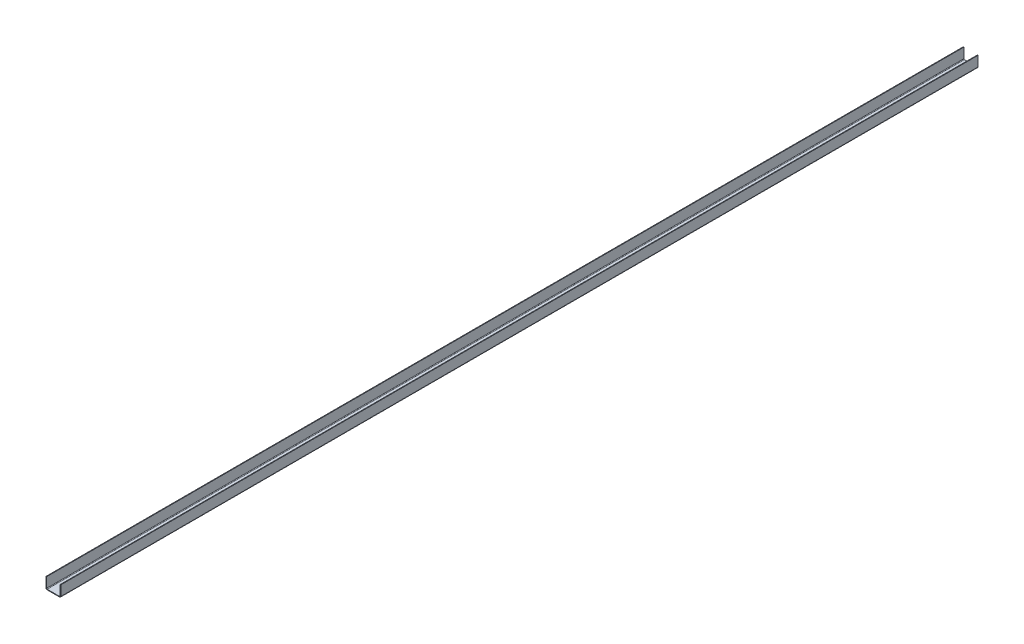
ISO-10303-21;
HEADER;
FILE_DESCRIPTION(('STEP AP214'),'2;1');
FILE_NAME('part.step','',(''),(''),'','','');
FILE_SCHEMA(('AUTOMOTIVE_DESIGN { 1 0 10303 214 1 1 1 1 }'));
ENDSEC;
DATA;
#1=APPLICATION_CONTEXT('core data for automotive mechanical design processes');
#2=APPLICATION_PROTOCOL_DEFINITION('international standard','automotive_design',2000,#1);
#3=PRODUCT_CONTEXT('',#1,'mechanical');
#4=PRODUCT('Part','Part','',(#3));
#5=PRODUCT_RELATED_PRODUCT_CATEGORY('part','',(#4));
#6=PRODUCT_DEFINITION_FORMATION('','',#4);
#7=PRODUCT_DEFINITION_CONTEXT('part definition',#1,'design');
#8=PRODUCT_DEFINITION('design','',#6,#7);
#9=PRODUCT_DEFINITION_SHAPE('','',#8);
#10=(LENGTH_UNIT() NAMED_UNIT(*) SI_UNIT(.MILLI.,.METRE.));
#11=(NAMED_UNIT(*) PLANE_ANGLE_UNIT() SI_UNIT($,.RADIAN.));
#12=(NAMED_UNIT(*) SI_UNIT($,.STERADIAN.) SOLID_ANGLE_UNIT());
#13=UNCERTAINTY_MEASURE_WITH_UNIT(LENGTH_MEASURE(1.E-05),#10,'distance_accuracy_value','');
#14=(GEOMETRIC_REPRESENTATION_CONTEXT(3) GLOBAL_UNCERTAINTY_ASSIGNED_CONTEXT((#13)) GLOBAL_UNIT_ASSIGNED_CONTEXT((#10,
#11,#12)) REPRESENTATION_CONTEXT('',''));
#15=CARTESIAN_POINT('',(0.,0.,0.));
#16=DIRECTION('',(0.,0.,1.));
#17=DIRECTION('',(1.,0.,0.));
#18=AXIS2_PLACEMENT_3D('',#15,#16,#17);
#19=CARTESIAN_POINT('',(0.,-34.5,1915.));
#20=DIRECTION('',(0.,1.,0.));
#21=DIRECTION('',(0.,0.,1.));
#22=AXIS2_PLACEMENT_3D('',#19,#20,#21);
#23=CYLINDRICAL_SURFACE('',#22,3.24999999999999);
#24=CARTESIAN_POINT('',(0.,-26.,1915.));
#25=DIRECTION('',(0.,-1.,0.));
#26=DIRECTION('',(0.,0.,-1.));
#27=AXIS2_PLACEMENT_3D('',#24,#25,#26);
#28=CIRCLE('',#27,3.24999999999999);
#29=CARTESIAN_POINT('',(0.,-26.,1911.75));
#30=VERTEX_POINT('',#29);
#31=EDGE_CURVE('E44',#30,#30,#28,.T.);
#32=ORIENTED_EDGE('',*,*,#31,.T.);
#33=EDGE_LOOP('',(#32));
#34=FACE_BOUND('',#33,.T.);
#35=CARTESIAN_POINT('',(0.,-24.5,1915.));
#36=DIRECTION('',(0.,1.,0.));
#37=DIRECTION('',(0.,0.,1.));
#38=AXIS2_PLACEMENT_3D('',#35,#36,#37);
#39=CIRCLE('',#38,3.24999999999999);
#40=CARTESIAN_POINT('',(0.,-24.5,1918.25));
#41=VERTEX_POINT('',#40);
#42=EDGE_CURVE('E11',#41,#41,#39,.T.);
#43=ORIENTED_EDGE('',*,*,#42,.T.);
#44=EDGE_LOOP('',(#43));
#45=FACE_BOUND('',#44,.T.);
#46=ADVANCED_FACE('F36',(#34,#45),#23,.F.);
#47=CARTESIAN_POINT('',(-18.66,-23.,2300.));
#48=DIRECTION('',(-1.,0.,0.));
#49=DIRECTION('',(0.,0.,1.));
#50=AXIS2_PLACEMENT_3D('',#47,#48,#49);
#51=PLANE('',#50);
#52=DIRECTION('',(0.,1.,0.));
#53=VECTOR('',#52,1.);
#54=CARTESIAN_POINT('',(-18.66,-23.,0.));
#55=LINE('',#54,#53);
#56=CARTESIAN_POINT('',(-18.66,-23.,0.));
#57=VERTEX_POINT('',#56);
#58=CARTESIAN_POINT('',(-18.66,2.,0.));
#59=VERTEX_POINT('',#58);
#60=EDGE_CURVE('E158',#57,#59,#55,.T.);
#61=ORIENTED_EDGE('',*,*,#60,.T.);
#62=DIRECTION('',(0.,0.,-1.));
#63=VECTOR('',#62,1.);
#64=CARTESIAN_POINT('',(-18.66,2.,2300.));
#65=LINE('',#64,#63);
#66=CARTESIAN_POINT('',(-18.66,2.,2300.));
#67=VERTEX_POINT('',#66);
#68=EDGE_CURVE('E205',#67,#59,#65,.T.);
#69=ORIENTED_EDGE('',*,*,#68,.F.);
#70=DIRECTION('',(0.,1.,0.));
#71=VECTOR('',#70,1.);
#72=CARTESIAN_POINT('',(-18.66,-23.,2300.));
#73=LINE('',#72,#71);
#74=CARTESIAN_POINT('',(-18.66,-23.,2300.));
#75=VERTEX_POINT('',#74);
#76=EDGE_CURVE('E105',#75,#67,#73,.T.);
#77=ORIENTED_EDGE('',*,*,#76,.F.);
#78=DIRECTION('',(0.,0.,-1.));
#79=VECTOR('',#78,1.);
#80=CARTESIAN_POINT('',(-18.66,-23.,2300.));
#81=LINE('',#80,#79);
#82=EDGE_CURVE('E154',#75,#57,#81,.T.);
#83=ORIENTED_EDGE('',*,*,#82,.T.);
#84=EDGE_LOOP('',(#61,#69,#77,#83));
#85=FACE_BOUND('',#84,.T.);
#86=ADVANCED_FACE('F230',(#85),#51,.F.);
#87=CARTESIAN_POINT('',(-20.16,2.,2300.));
#88=DIRECTION('',(0.,1.,0.));
#89=DIRECTION('',(-1.,0.,0.));
#90=AXIS2_PLACEMENT_3D('',#87,#88,#89);
#91=PLANE('',#90);
#92=DIRECTION('',(1.,0.,0.));
#93=VECTOR('',#92,1.);
#94=CARTESIAN_POINT('',(-20.16,2.,0.));
#95=LINE('',#94,#93);
#96=CARTESIAN_POINT('',(-20.16,2.,0.));
#97=VERTEX_POINT('',#96);
#98=EDGE_CURVE('E161',#97,#59,#95,.T.);
#99=ORIENTED_EDGE('',*,*,#98,.F.);
#100=DIRECTION('',(0.,0.,-1.));
#101=VECTOR('',#100,1.);
#102=CARTESIAN_POINT('',(-20.16,2.,2300.));
#103=LINE('',#102,#101);
#104=CARTESIAN_POINT('',(-20.16,2.,2300.));
#105=VERTEX_POINT('',#104);
#106=EDGE_CURVE('E203',#105,#97,#103,.T.);
#107=ORIENTED_EDGE('',*,*,#106,.F.);
#108=DIRECTION('',(1.,0.,0.));
#109=VECTOR('',#108,1.);
#110=CARTESIAN_POINT('',(-20.16,2.,2300.));
#111=LINE('',#110,#109);
#112=EDGE_CURVE('E265',#105,#67,#111,.T.);
#113=ORIENTED_EDGE('',*,*,#112,.T.);
#114=ORIENTED_EDGE('',*,*,#68,.T.);
#115=EDGE_LOOP('',(#99,#107,#113,#114));
#116=FACE_BOUND('',#115,.T.);
#117=ADVANCED_FACE('F234',(#116),#91,.T.);
#118=CARTESIAN_POINT('',(-20.16,-23.,2300.));
#119=DIRECTION('',(-1.,0.,0.));
#120=DIRECTION('',(0.,0.,1.));
#121=AXIS2_PLACEMENT_3D('',#118,#119,#120);
#122=PLANE('',#121);
#123=DIRECTION('',(0.,1.,0.));
#124=VECTOR('',#123,1.);
#125=CARTESIAN_POINT('',(-20.16,-23.,0.));
#126=LINE('',#125,#124);
#127=CARTESIAN_POINT('',(-20.16,-23.,0.));
#128=VERTEX_POINT('',#127);
#129=EDGE_CURVE('E165',#128,#97,#126,.T.);
#130=ORIENTED_EDGE('',*,*,#129,.F.);
#131=DIRECTION('',(0.,0.,-1.));
#132=VECTOR('',#131,1.);
#133=CARTESIAN_POINT('',(-20.16,-23.,2300.));
#134=LINE('',#133,#132);
#135=CARTESIAN_POINT('',(-20.16,-23.,2300.));
#136=VERTEX_POINT('',#135);
#137=EDGE_CURVE('E201',#136,#128,#134,.T.);
#138=ORIENTED_EDGE('',*,*,#137,.F.);
#139=DIRECTION('',(0.,1.,0.));
#140=VECTOR('',#139,1.);
#141=CARTESIAN_POINT('',(-20.16,-23.,2300.));
#142=LINE('',#141,#140);
#143=EDGE_CURVE('E261',#136,#105,#142,.T.);
#144=ORIENTED_EDGE('',*,*,#143,.T.);
#145=ORIENTED_EDGE('',*,*,#106,.T.);
#146=EDGE_LOOP('',(#130,#138,#144,#145));
#147=FACE_BOUND('',#146,.T.);
#148=ADVANCED_FACE('F224',(#147),#122,.T.);
#149=CARTESIAN_POINT('',(-17.16,-23.,2300.));
#150=DIRECTION('',(0.,0.,-1.));
#151=DIRECTION('',(-1.,0.,0.));
#152=AXIS2_PLACEMENT_3D('',#149,#150,#151);
#153=CYLINDRICAL_SURFACE('',#152,3.);
#154=CARTESIAN_POINT('',(-17.16,-23.,0.));
#155=DIRECTION('',(0.,0.,-1.));
#156=DIRECTION('',(1.,0.,0.));
#157=AXIS2_PLACEMENT_3D('',#154,#155,#156);
#158=CIRCLE('',#157,3.);
#159=CARTESIAN_POINT('',(-17.16,-26.,0.));
#160=VERTEX_POINT('',#159);
#161=EDGE_CURVE('E168',#160,#128,#158,.T.);
#162=ORIENTED_EDGE('',*,*,#161,.F.);
#163=DIRECTION('',(0.,0.,-1.));
#164=VECTOR('',#163,1.);
#165=CARTESIAN_POINT('',(-17.16,-26.,2300.));
#166=LINE('',#165,#164);
#167=CARTESIAN_POINT('',(-17.16,-26.,2300.));
#168=VERTEX_POINT('',#167);
#169=EDGE_CURVE('E199',#168,#160,#166,.T.);
#170=ORIENTED_EDGE('',*,*,#169,.F.);
#171=CARTESIAN_POINT('',(-17.16,-23.,2300.));
#172=DIRECTION('',(0.,0.,-1.));
#173=DIRECTION('',(1.,0.,0.));
#174=AXIS2_PLACEMENT_3D('',#171,#172,#173);
#175=CIRCLE('',#174,3.);
#176=EDGE_CURVE('E257',#168,#136,#175,.T.);
#177=ORIENTED_EDGE('',*,*,#176,.T.);
#178=ORIENTED_EDGE('',*,*,#137,.T.);
#179=EDGE_LOOP('',(#162,#170,#177,#178));
#180=FACE_BOUND('',#179,.T.);
#181=ADVANCED_FACE('F214',(#180),#153,.T.);
#182=CARTESIAN_POINT('',(13.84,-26.,2300.));
#183=DIRECTION('',(0.,-1.,0.));
#184=DIRECTION('',(0.,0.,-1.));
#185=AXIS2_PLACEMENT_3D('',#182,#183,#184);
#186=PLANE('',#185);
#187=CARTESIAN_POINT('',(0.,-26.,1149.));
#188=DIRECTION('',(0.,-1.,0.));
#189=DIRECTION('',(0.,0.,-1.));
#190=AXIS2_PLACEMENT_3D('',#187,#188,#189);
#191=CIRCLE('',#190,3.24999999999999);
#192=CARTESIAN_POINT('',(0.,-26.,1145.75));
#193=VERTEX_POINT('',#192);
#194=EDGE_CURVE('E385',#193,#193,#191,.T.);
#195=ORIENTED_EDGE('',*,*,#194,.F.);
#196=EDGE_LOOP('',(#195));
#197=FACE_BOUND('',#196,.T.);
#198=CARTESIAN_POINT('',(0.,-26.,383.));
#199=DIRECTION('',(0.,-1.,0.));
#200=DIRECTION('',(0.,0.,-1.));
#201=AXIS2_PLACEMENT_3D('',#198,#199,#200);
#202=CIRCLE('',#201,3.24999999999999);
#203=CARTESIAN_POINT('',(0.,-26.,379.75));
#204=VERTEX_POINT('',#203);
#205=EDGE_CURVE('E162',#204,#204,#202,.T.);
#206=ORIENTED_EDGE('',*,*,#205,.F.);
#207=EDGE_LOOP('',(#206));
#208=FACE_BOUND('',#207,.T.);
#209=DIRECTION('',(-1.,0.,0.));
#210=VECTOR('',#209,1.);
#211=CARTESIAN_POINT('',(13.84,-26.,0.));
#212=LINE('',#211,#210);
#213=CARTESIAN_POINT('',(13.84,-26.,0.));
#214=VERTEX_POINT('',#213);
#215=EDGE_CURVE('E171',#214,#160,#212,.T.);
#216=ORIENTED_EDGE('',*,*,#215,.F.);
#217=DIRECTION('',(0.,0.,-1.));
#218=VECTOR('',#217,1.);
#219=CARTESIAN_POINT('',(13.84,-26.,2300.));
#220=LINE('',#219,#218);
#221=CARTESIAN_POINT('',(13.84,-26.,2300.));
#222=VERTEX_POINT('',#221);
#223=EDGE_CURVE('E197',#222,#214,#220,.T.);
#224=ORIENTED_EDGE('',*,*,#223,.F.);
#225=DIRECTION('',(-1.,0.,0.));
#226=VECTOR('',#225,1.);
#227=CARTESIAN_POINT('',(13.84,-26.,2300.));
#228=LINE('',#227,#226);
#229=EDGE_CURVE('E260',#222,#168,#228,.T.);
#230=ORIENTED_EDGE('',*,*,#229,.T.);
#231=ORIENTED_EDGE('',*,*,#169,.T.);
#232=EDGE_LOOP('',(#216,#224,#230,#231));
#233=FACE_BOUND('',#232,.T.);
#234=ORIENTED_EDGE('',*,*,#31,.F.);
#235=EDGE_LOOP('',(#234));
#236=FACE_BOUND('',#235,.T.);
#237=ADVANCED_FACE('F211',(#197,#208,#233,#236),#186,.T.);
#238=CARTESIAN_POINT('',(13.84,-23.,2300.));
#239=DIRECTION('',(0.,0.,-1.));
#240=DIRECTION('',(-1.,0.,0.));
#241=AXIS2_PLACEMENT_3D('',#238,#239,#240);
#242=CYLINDRICAL_SURFACE('',#241,3.);
#243=CARTESIAN_POINT('',(13.84,-23.,0.));
#244=DIRECTION('',(0.,0.,-1.));
#245=DIRECTION('',(-1.,0.,0.));
#246=AXIS2_PLACEMENT_3D('',#243,#244,#245);
#247=CIRCLE('',#246,3.);
#248=CARTESIAN_POINT('',(16.84,-23.,0.));
#249=VERTEX_POINT('',#248);
#250=EDGE_CURVE('E174',#249,#214,#247,.T.);
#251=ORIENTED_EDGE('',*,*,#250,.F.);
#252=DIRECTION('',(0.,0.,-1.));
#253=VECTOR('',#252,1.);
#254=CARTESIAN_POINT('',(16.84,-23.,2300.));
#255=LINE('',#254,#253);
#256=CARTESIAN_POINT('',(16.84,-23.,2300.));
#257=VERTEX_POINT('',#256);
#258=EDGE_CURVE('E195',#257,#249,#255,.T.);
#259=ORIENTED_EDGE('',*,*,#258,.F.);
#260=CARTESIAN_POINT('',(13.84,-23.,2300.));
#261=DIRECTION('',(0.,0.,-1.));
#262=DIRECTION('',(-1.,0.,0.));
#263=AXIS2_PLACEMENT_3D('',#260,#261,#262);
#264=CIRCLE('',#263,3.);
#265=EDGE_CURVE('E263',#257,#222,#264,.T.);
#266=ORIENTED_EDGE('',*,*,#265,.T.);
#267=ORIENTED_EDGE('',*,*,#223,.T.);
#268=EDGE_LOOP('',(#251,#259,#266,#267));
#269=FACE_BOUND('',#268,.T.);
#270=ADVANCED_FACE('F213',(#269),#242,.T.);
#271=CARTESIAN_POINT('',(16.84,2.,2300.));
#272=DIRECTION('',(1.,0.,0.));
#273=DIRECTION('',(0.,1.,0.));
#274=AXIS2_PLACEMENT_3D('',#271,#272,#273);
#275=PLANE('',#274);
#276=DIRECTION('',(0.,-1.,0.));
#277=VECTOR('',#276,1.);
#278=CARTESIAN_POINT('',(16.84,2.,0.));
#279=LINE('',#278,#277);
#280=CARTESIAN_POINT('',(16.84,2.,0.));
#281=VERTEX_POINT('',#280);
#282=EDGE_CURVE('E177',#281,#249,#279,.T.);
#283=ORIENTED_EDGE('',*,*,#282,.F.);
#284=DIRECTION('',(0.,0.,-1.));
#285=VECTOR('',#284,1.);
#286=CARTESIAN_POINT('',(16.84,2.,2300.));
#287=LINE('',#286,#285);
#288=CARTESIAN_POINT('',(16.84,2.,2300.));
#289=VERTEX_POINT('',#288);
#290=EDGE_CURVE('E193',#289,#281,#287,.T.);
#291=ORIENTED_EDGE('',*,*,#290,.F.);
#292=DIRECTION('',(0.,-1.,0.));
#293=VECTOR('',#292,1.);
#294=CARTESIAN_POINT('',(16.84,2.,2300.));
#295=LINE('',#294,#293);
#296=EDGE_CURVE('E271',#289,#257,#295,.T.);
#297=ORIENTED_EDGE('',*,*,#296,.T.);
#298=ORIENTED_EDGE('',*,*,#258,.T.);
#299=EDGE_LOOP('',(#283,#291,#297,#298));
#300=FACE_BOUND('',#299,.T.);
#301=ADVANCED_FACE('F221',(#300),#275,.T.);
#302=CARTESIAN_POINT('',(15.34,2.,2300.));
#303=DIRECTION('',(0.,1.,0.));
#304=DIRECTION('',(0.,0.,1.));
#305=AXIS2_PLACEMENT_3D('',#302,#303,#304);
#306=PLANE('',#305);
#307=DIRECTION('',(1.,0.,0.));
#308=VECTOR('',#307,1.);
#309=CARTESIAN_POINT('',(15.34,2.,0.));
#310=LINE('',#309,#308);
#311=CARTESIAN_POINT('',(15.34,2.,0.));
#312=VERTEX_POINT('',#311);
#313=EDGE_CURVE('E180',#312,#281,#310,.T.);
#314=ORIENTED_EDGE('',*,*,#313,.F.);
#315=DIRECTION('',(0.,0.,-1.));
#316=VECTOR('',#315,1.);
#317=CARTESIAN_POINT('',(15.34,2.,2300.));
#318=LINE('',#317,#316);
#319=CARTESIAN_POINT('',(15.34,2.,2300.));
#320=VERTEX_POINT('',#319);
#321=EDGE_CURVE('E191',#320,#312,#318,.T.);
#322=ORIENTED_EDGE('',*,*,#321,.F.);
#323=DIRECTION('',(1.,0.,0.));
#324=VECTOR('',#323,1.);
#325=CARTESIAN_POINT('',(15.34,2.,2300.));
#326=LINE('',#325,#324);
#327=EDGE_CURVE('E274',#320,#289,#326,.T.);
#328=ORIENTED_EDGE('',*,*,#327,.T.);
#329=ORIENTED_EDGE('',*,*,#290,.T.);
#330=EDGE_LOOP('',(#314,#322,#328,#329));
#331=FACE_BOUND('',#330,.T.);
#332=ADVANCED_FACE('F278',(#331),#306,.T.);
#333=CARTESIAN_POINT('',(15.34,2.,2300.));
#334=DIRECTION('',(1.,0.,0.));
#335=DIRECTION('',(0.,1.,0.));
#336=AXIS2_PLACEMENT_3D('',#333,#334,#335);
#337=PLANE('',#336);
#338=DIRECTION('',(0.,-1.,0.));
#339=VECTOR('',#338,1.);
#340=CARTESIAN_POINT('',(15.34,2.,0.));
#341=LINE('',#340,#339);
#342=CARTESIAN_POINT('',(15.34,-23.,0.));
#343=VERTEX_POINT('',#342);
#344=EDGE_CURVE('E183',#312,#343,#341,.T.);
#345=ORIENTED_EDGE('',*,*,#344,.T.);
#346=DIRECTION('',(0.,0.,-1.));
#347=VECTOR('',#346,1.);
#348=CARTESIAN_POINT('',(15.34,-23.,2300.));
#349=LINE('',#348,#347);
#350=CARTESIAN_POINT('',(15.34,-23.,2300.));
#351=VERTEX_POINT('',#350);
#352=EDGE_CURVE('E148',#351,#343,#349,.T.);
#353=ORIENTED_EDGE('',*,*,#352,.F.);
#354=DIRECTION('',(0.,-1.,0.));
#355=VECTOR('',#354,1.);
#356=CARTESIAN_POINT('',(15.34,2.,2300.));
#357=LINE('',#356,#355);
#358=EDGE_CURVE('E139',#320,#351,#357,.T.);
#359=ORIENTED_EDGE('',*,*,#358,.F.);
#360=ORIENTED_EDGE('',*,*,#321,.T.);
#361=EDGE_LOOP('',(#345,#353,#359,#360));
#362=FACE_BOUND('',#361,.T.);
#363=ADVANCED_FACE('F286',(#362),#337,.F.);
#364=CARTESIAN_POINT('',(13.84,-23.,2300.));
#365=DIRECTION('',(0.,0.,-1.));
#366=DIRECTION('',(-1.,0.,0.));
#367=AXIS2_PLACEMENT_3D('',#364,#365,#366);
#368=CYLINDRICAL_SURFACE('',#367,1.5);
#369=CARTESIAN_POINT('',(13.84,-23.,0.));
#370=DIRECTION('',(0.,0.,1.));
#371=DIRECTION('',(1.,0.,0.));
#372=AXIS2_PLACEMENT_3D('',#369,#370,#371);
#373=CIRCLE('',#372,1.5);
#374=CARTESIAN_POINT('',(13.84,-24.5,0.));
#375=VERTEX_POINT('',#374);
#376=EDGE_CURVE('E147',#343,#375,#373,.F.);
#377=ORIENTED_EDGE('',*,*,#376,.T.);
#378=DIRECTION('',(0.,0.,-1.));
#379=VECTOR('',#378,1.);
#380=CARTESIAN_POINT('',(13.84,-24.5,2300.));
#381=LINE('',#380,#379);
#382=CARTESIAN_POINT('',(13.84,-24.5,2300.));
#383=VERTEX_POINT('',#382);
#384=EDGE_CURVE('E144',#383,#375,#381,.T.);
#385=ORIENTED_EDGE('',*,*,#384,.F.);
#386=CARTESIAN_POINT('',(13.84,-23.,2300.));
#387=DIRECTION('',(0.,0.,1.));
#388=DIRECTION('',(1.,0.,0.));
#389=AXIS2_PLACEMENT_3D('',#386,#387,#388);
#390=CIRCLE('',#389,1.5);
#391=EDGE_CURVE('E132',#351,#383,#390,.F.);
#392=ORIENTED_EDGE('',*,*,#391,.F.);
#393=ORIENTED_EDGE('',*,*,#352,.T.);
#394=EDGE_LOOP('',(#377,#385,#392,#393));
#395=FACE_BOUND('',#394,.T.);
#396=ADVANCED_FACE('F145',(#395),#368,.F.);
#397=CARTESIAN_POINT('',(13.84,-24.5,2300.));
#398=DIRECTION('',(0.,-1.,0.));
#399=DIRECTION('',(0.,0.,-1.));
#400=AXIS2_PLACEMENT_3D('',#397,#398,#399);
#401=PLANE('',#400);
#402=CARTESIAN_POINT('',(0.,-24.5,1149.));
#403=DIRECTION('',(0.,1.,0.));
#404=DIRECTION('',(0.,0.,1.));
#405=AXIS2_PLACEMENT_3D('',#402,#403,#404);
#406=CIRCLE('',#405,3.24999999999999);
#407=CARTESIAN_POINT('',(0.,-24.5,1152.25));
#408=VERTEX_POINT('',#407);
#409=EDGE_CURVE('E388',#408,#408,#406,.T.);
#410=ORIENTED_EDGE('',*,*,#409,.F.);
#411=EDGE_LOOP('',(#410));
#412=FACE_BOUND('',#411,.T.);
#413=CARTESIAN_POINT('',(0.,-24.5,383.));
#414=DIRECTION('',(0.,1.,0.));
#415=DIRECTION('',(0.,0.,1.));
#416=AXIS2_PLACEMENT_3D('',#413,#414,#415);
#417=CIRCLE('',#416,3.24999999999999);
#418=CARTESIAN_POINT('',(0.,-24.5,386.25));
#419=VERTEX_POINT('',#418);
#420=EDGE_CURVE('E389',#419,#419,#417,.T.);
#421=ORIENTED_EDGE('',*,*,#420,.F.);
#422=EDGE_LOOP('',(#421));
#423=FACE_BOUND('',#422,.T.);
#424=DIRECTION('',(1.,0.,0.));
#425=VECTOR('',#424,1.);
#426=CARTESIAN_POINT('',(13.84,-24.5,0.));
#427=LINE('',#426,#425);
#428=CARTESIAN_POINT('',(-17.16,-24.5,0.));
#429=VERTEX_POINT('',#428);
#430=EDGE_CURVE('E93',#375,#429,#427,.F.);
#431=ORIENTED_EDGE('',*,*,#430,.T.);
#432=DIRECTION('',(0.,0.,-1.));
#433=VECTOR('',#432,1.);
#434=CARTESIAN_POINT('',(-17.16,-24.5,2300.));
#435=LINE('',#434,#433);
#436=CARTESIAN_POINT('',(-17.16,-24.5,2300.));
#437=VERTEX_POINT('',#436);
#438=EDGE_CURVE('E149',#437,#429,#435,.T.);
#439=ORIENTED_EDGE('',*,*,#438,.F.);
#440=DIRECTION('',(1.,0.,0.));
#441=VECTOR('',#440,1.);
#442=CARTESIAN_POINT('',(13.84,-24.5,2300.));
#443=LINE('',#442,#441);
#444=EDGE_CURVE('E136',#383,#437,#443,.F.);
#445=ORIENTED_EDGE('',*,*,#444,.F.);
#446=ORIENTED_EDGE('',*,*,#384,.T.);
#447=EDGE_LOOP('',(#431,#439,#445,#446));
#448=FACE_BOUND('',#447,.T.);
#449=ORIENTED_EDGE('',*,*,#42,.F.);
#450=EDGE_LOOP('',(#449));
#451=FACE_BOUND('',#450,.T.);
#452=ADVANCED_FACE('F151',(#412,#423,#448,#451),#401,.F.);
#453=CARTESIAN_POINT('',(-17.16,-23.,2300.));
#454=DIRECTION('',(0.,0.,-1.));
#455=DIRECTION('',(-1.,0.,0.));
#456=AXIS2_PLACEMENT_3D('',#453,#454,#455);
#457=CYLINDRICAL_SURFACE('',#456,1.5);
#458=CARTESIAN_POINT('',(-17.16,-23.,0.));
#459=DIRECTION('',(0.,0.,1.));
#460=DIRECTION('',(1.,0.,0.));
#461=AXIS2_PLACEMENT_3D('',#458,#459,#460);
#462=CIRCLE('',#461,1.5);
#463=EDGE_CURVE('E99',#429,#57,#462,.F.);
#464=ORIENTED_EDGE('',*,*,#463,.T.);
#465=ORIENTED_EDGE('',*,*,#82,.F.);
#466=CARTESIAN_POINT('',(-17.16,-23.,2300.));
#467=DIRECTION('',(0.,0.,1.));
#468=DIRECTION('',(1.,0.,0.));
#469=AXIS2_PLACEMENT_3D('',#466,#467,#468);
#470=CIRCLE('',#469,1.5);
#471=EDGE_CURVE('E52',#437,#75,#470,.F.);
#472=ORIENTED_EDGE('',*,*,#471,.F.);
#473=ORIENTED_EDGE('',*,*,#438,.T.);
#474=EDGE_LOOP('',(#464,#465,#472,#473));
#475=FACE_BOUND('',#474,.T.);
#476=ADVANCED_FACE('F323',(#475),#457,.F.);
#477=CARTESIAN_POINT('',(-17.16,-23.,2300.));
#478=DIRECTION('',(0.,0.,-1.));
#479=DIRECTION('',(-1.,0.,0.));
#480=AXIS2_PLACEMENT_3D('',#477,#478,#479);
#481=PLANE('',#480);
#482=ORIENTED_EDGE('',*,*,#76,.T.);
#483=ORIENTED_EDGE('',*,*,#112,.F.);
#484=ORIENTED_EDGE('',*,*,#143,.F.);
#485=ORIENTED_EDGE('',*,*,#176,.F.);
#486=ORIENTED_EDGE('',*,*,#229,.F.);
#487=ORIENTED_EDGE('',*,*,#265,.F.);
#488=ORIENTED_EDGE('',*,*,#296,.F.);
#489=ORIENTED_EDGE('',*,*,#327,.F.);
#490=ORIENTED_EDGE('',*,*,#358,.T.);
#491=ORIENTED_EDGE('',*,*,#391,.T.);
#492=ORIENTED_EDGE('',*,*,#444,.T.);
#493=ORIENTED_EDGE('',*,*,#471,.T.);
#494=EDGE_LOOP('',(#482,#483,#484,#485,#486,#487,#488,#489,#490,#491,#492,#493));
#495=FACE_BOUND('',#494,.T.);
#496=ADVANCED_FACE('F134',(#495),#481,.F.);
#497=CARTESIAN_POINT('',(-17.16,-23.,0.));
#498=DIRECTION('',(0.,0.,-1.));
#499=DIRECTION('',(-1.,0.,0.));
#500=AXIS2_PLACEMENT_3D('',#497,#498,#499);
#501=PLANE('',#500);
#502=ORIENTED_EDGE('',*,*,#60,.F.);
#503=ORIENTED_EDGE('',*,*,#463,.F.);
#504=ORIENTED_EDGE('',*,*,#430,.F.);
#505=ORIENTED_EDGE('',*,*,#376,.F.);
#506=ORIENTED_EDGE('',*,*,#344,.F.);
#507=ORIENTED_EDGE('',*,*,#313,.T.);
#508=ORIENTED_EDGE('',*,*,#282,.T.);
#509=ORIENTED_EDGE('',*,*,#250,.T.);
#510=ORIENTED_EDGE('',*,*,#215,.T.);
#511=ORIENTED_EDGE('',*,*,#161,.T.);
#512=ORIENTED_EDGE('',*,*,#129,.T.);
#513=ORIENTED_EDGE('',*,*,#98,.T.);
#514=EDGE_LOOP('',(#502,#503,#504,#505,#506,#507,#508,#509,#510,#511,#512,#513));
#515=FACE_BOUND('',#514,.T.);
#516=ADVANCED_FACE('F253',(#515),#501,.T.);
#517=CARTESIAN_POINT('',(0.,-34.5,383.));
#518=DIRECTION('',(0.,1.,0.));
#519=DIRECTION('',(0.,0.,1.));
#520=AXIS2_PLACEMENT_3D('',#517,#518,#519);
#521=CYLINDRICAL_SURFACE('',#520,3.24999999999999);
#522=ORIENTED_EDGE('',*,*,#205,.T.);
#523=EDGE_LOOP('',(#522));
#524=FACE_BOUND('',#523,.T.);
#525=ORIENTED_EDGE('',*,*,#420,.T.);
#526=EDGE_LOOP('',(#525));
#527=FACE_BOUND('',#526,.T.);
#528=ADVANCED_FACE('F344',(#524,#527),#521,.F.);
#529=CARTESIAN_POINT('',(0.,-34.5,1149.));
#530=DIRECTION('',(0.,1.,0.));
#531=DIRECTION('',(0.,0.,1.));
#532=AXIS2_PLACEMENT_3D('',#529,#530,#531);
#533=CYLINDRICAL_SURFACE('',#532,3.24999999999999);
#534=ORIENTED_EDGE('',*,*,#194,.T.);
#535=EDGE_LOOP('',(#534));
#536=FACE_BOUND('',#535,.T.);
#537=ORIENTED_EDGE('',*,*,#409,.T.);
#538=EDGE_LOOP('',(#537));
#539=FACE_BOUND('',#538,.T.);
#540=ADVANCED_FACE('F352',(#536,#539),#533,.F.);
#541=CLOSED_SHELL('',(#46,#86,#117,#148,#181,#237,#270,#301,#332,#363,#396,#452,#476,#496,#516,
#528,#540));
#542=MANIFOLD_SOLID_BREP('B2',#541);
#543=ADVANCED_BREP_SHAPE_REPRESENTATION('',(#18,#542),#14);
#544=SHAPE_DEFINITION_REPRESENTATION(#9,#543);
ENDSEC;
END-ISO-10303-21;
